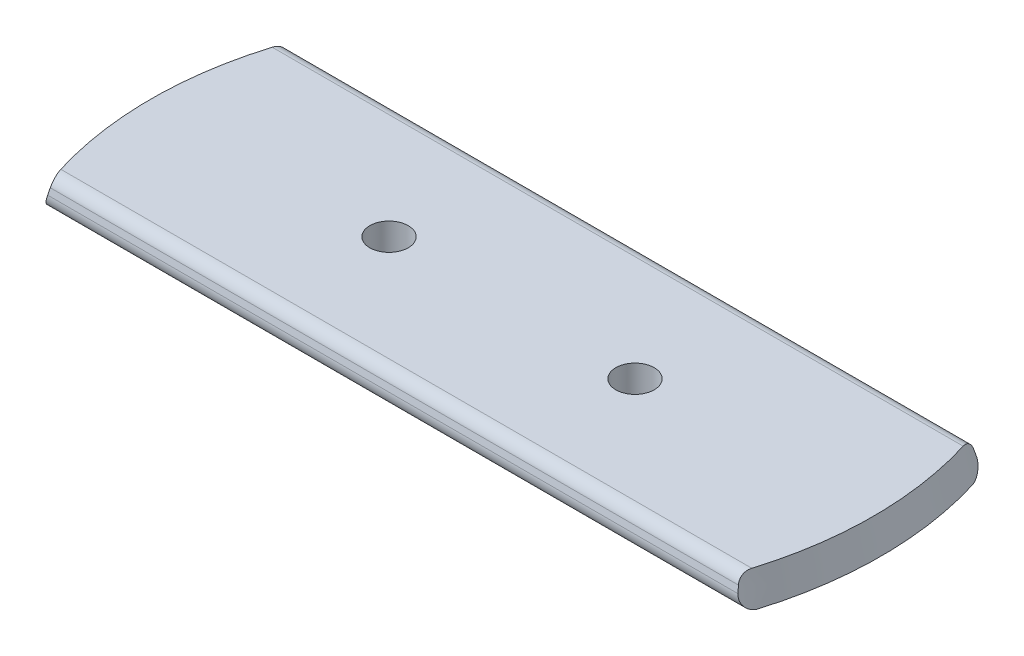
ISO-10303-21;
HEADER;
FILE_DESCRIPTION(('STEP AP214'),'2;1');
FILE_NAME('part.step','',(''),(''),'','','');
FILE_SCHEMA(('AUTOMOTIVE_DESIGN { 1 0 10303 214 1 1 1 1 }'));
ENDSEC;
DATA;
#1=APPLICATION_CONTEXT('core data for automotive mechanical design processes');
#2=APPLICATION_PROTOCOL_DEFINITION('international standard','automotive_design',2000,#1);
#3=PRODUCT_CONTEXT('',#1,'mechanical');
#4=PRODUCT('Part','Part','',(#3));
#5=PRODUCT_RELATED_PRODUCT_CATEGORY('part','',(#4));
#6=PRODUCT_DEFINITION_FORMATION('','',#4);
#7=PRODUCT_DEFINITION_CONTEXT('part definition',#1,'design');
#8=PRODUCT_DEFINITION('design','',#6,#7);
#9=PRODUCT_DEFINITION_SHAPE('','',#8);
#10=(LENGTH_UNIT() NAMED_UNIT(*) SI_UNIT(.MILLI.,.METRE.));
#11=(NAMED_UNIT(*) PLANE_ANGLE_UNIT() SI_UNIT($,.RADIAN.));
#12=(NAMED_UNIT(*) SI_UNIT($,.STERADIAN.) SOLID_ANGLE_UNIT());
#13=UNCERTAINTY_MEASURE_WITH_UNIT(LENGTH_MEASURE(1.E-05),#10,'distance_accuracy_value','');
#14=(GEOMETRIC_REPRESENTATION_CONTEXT(3) GLOBAL_UNCERTAINTY_ASSIGNED_CONTEXT((#13)) GLOBAL_UNIT_ASSIGNED_CONTEXT((#10,
#11,#12)) REPRESENTATION_CONTEXT('',''));
#15=CARTESIAN_POINT('',(0.,0.,0.));
#16=DIRECTION('',(0.,0.,1.));
#17=DIRECTION('',(1.,0.,0.));
#18=AXIS2_PLACEMENT_3D('',#15,#16,#17);
#19=CARTESIAN_POINT('',(0.,0.,0.));
#20=DIRECTION('',(0.,-1.,0.));
#21=DIRECTION('',(0.,0.,1.));
#22=AXIS2_PLACEMENT_3D('',#19,#20,#21);
#23=CONICAL_SURFACE('',#22,7.62,0.244346095279206);
#24=CARTESIAN_POINT('',(-7.07136729754981,0.635,-2.38167671819458));
#25=CARTESIAN_POINT('',(-7.09031812268111,0.529190850392023,-2.40805790214887));
#26=CARTESIAN_POINT('',(-7.10919666856523,0.423369608677368,-2.43444210100397));
#27=CARTESIAN_POINT('',(-7.14680920166574,0.211702942010479,-2.4872165282725));
#28=CARTESIAN_POINT('',(-7.16554318888345,0.105857517058467,-2.51360675668587));
#29=CARTESIAN_POINT('',(-7.18420489685532,0.,-2.54));
#30=B_SPLINE_CURVE_WITH_KNOTS('',3,(#24,#25,#26,#27,#28,#29),.UNSPECIFIED.,.F.,.F.,(4,2,4),(0.,
0.33204810762539,0.66409621218932),.UNSPECIFIED.);
#31=CARTESIAN_POINT('',(-7.10577247600336,0.44244816148174,-2.42968528353612));
#32=VERTEX_POINT('',#31);
#33=CARTESIAN_POINT('',(-7.12837396531329,0.315448161481469,-2.46134993989727));
#34=VERTEX_POINT('',#33);
#35=EDGE_CURVE('E102',#32,#34,#30,.T.);
#36=ORIENTED_EDGE('',*,*,#35,.T.);
#37=CARTESIAN_POINT('',(-7.12837396531835,0.315448161482316,-2.46134993989706));
#38=CARTESIAN_POINT('',(-7.13084393768899,0.301515160433442,-2.46483612463567));
#39=CARTESIAN_POINT('',(-7.1337918598921,0.287385541303617,-2.4670927922483));
#40=CARTESIAN_POINT('',(-7.1404914821392,0.25919177810484,-2.46922998415248));
#41=CARTESIAN_POINT('',(-7.14424002056994,0.245127592629542,-2.46911968984436));
#42=CARTESIAN_POINT('',(-7.152403715775,0.217430665918453,-2.46663344452182));
#43=CARTESIAN_POINT('',(-7.15681782558196,0.203797287044659,-2.46426102125269));
#44=CARTESIAN_POINT('',(-7.16617081488829,0.177250402664724,-2.45740982559918));
#45=CARTESIAN_POINT('',(-7.17111016999144,0.164337566010209,-2.45292913141014));
#46=CARTESIAN_POINT('',(-7.18169106797296,0.138724302566991,-2.44168856401171));
#47=CARTESIAN_POINT('',(-7.18735730178233,0.126089903395089,-2.43480159569103));
#48=CARTESIAN_POINT('',(-7.19894136926041,0.102236345878372,-2.41907129367297));
#49=CARTESIAN_POINT('',(-7.20485924437761,0.0910174218968979,-2.41022763666808));
#50=CARTESIAN_POINT('',(-7.21718697424704,0.0695298397669834,-2.39015817999625));
#51=CARTESIAN_POINT('',(-7.22360295844876,0.0593773660752167,-2.37881143554631));
#52=CARTESIAN_POINT('',(-7.23634002520104,0.0412272915812912,-2.35444655816891));
#53=CARTESIAN_POINT('',(-7.24266103599326,0.0332312496985651,-2.34142722608533));
#54=CARTESIAN_POINT('',(-7.25511941823189,0.019531569749466,-2.31380242139184));
#55=CARTESIAN_POINT('',(-7.26125131899737,0.0138725183345056,-2.29917230054427));
#56=CARTESIAN_POINT('',(-7.27298328432046,0.00532517605474581,-2.26895140657365));
#57=CARTESIAN_POINT('',(-7.27858466066921,0.00242988129697616,-2.2533631689033));
#58=CARTESIAN_POINT('',(-7.28629728384888,0.000338591472284553,-2.23003364885186));
#59=CARTESIAN_POINT('',(-7.28869471116603,-2.13890351914555E-06,-2.22247726528848));
#60=CARTESIAN_POINT('',(-7.29099725087828,0.,-2.21489482542296));
#61=B_SPLINE_CURVE_WITH_KNOTS('',3,(#37,#38,#39,#40,#41,#42,#43,#44,#45,#46,#47,#48,#49,#50,#51,
#52,#53,#54,#55,#56,#57,#58,#59,#60),.UNSPECIFIED.,.F.,.F.,(4,2,2,2,2,2,2,2,2,2,2,4),(0.,
0.0436250466490189,0.0870809032654025,0.130469101981918,0.173896928273261,0.220093463351432,
0.266297637281698,0.315637908405188,0.365013753373083,0.415292371505196,0.465443232968654,
0.489217638261168),.UNSPECIFIED.);
#62=CARTESIAN_POINT('',(-7.29099725087828,0.,-2.21489482542296));
#63=VERTEX_POINT('',#62);
#64=EDGE_CURVE('E109',#34,#63,#61,.T.);
#65=ORIENTED_EDGE('',*,*,#64,.T.);
#66=CARTESIAN_POINT('',(0.,0.,0.));
#67=DIRECTION('',(0.,1.,0.));
#68=DIRECTION('',(0.,0.,1.));
#69=AXIS2_PLACEMENT_3D('',#66,#67,#68);
#70=CIRCLE('',#69,7.62);
#71=CARTESIAN_POINT('',(-7.29099725087828,0.,2.21489482542296));
#72=VERTEX_POINT('',#71);
#73=EDGE_CURVE('E223',#63,#72,#70,.T.);
#74=ORIENTED_EDGE('',*,*,#73,.T.);
#75=CARTESIAN_POINT('',(-7.29099725087828,0.,2.21489482542296));
#76=CARTESIAN_POINT('',(-7.28638638414374,-7.59393130267067E-06,2.23008557273685));
#77=CARTESIAN_POINT('',(-7.28140331963555,0.00136128059969172,2.24513799558685));
#78=CARTESIAN_POINT('',(-7.27088782515327,0.00665497586977408,2.27454194812201));
#79=CARTESIAN_POINT('',(-7.26535697663801,0.0105726107175155,2.28889532674825));
#80=CARTESIAN_POINT('',(-7.2539207278495,0.0207620811084611,2.31654791265885));
#81=CARTESIAN_POINT('',(-7.24801584129948,0.0270307434945639,2.32984851169635));
#82=CARTESIAN_POINT('',(-7.23599614104069,0.0417092224968806,2.35511680914393));
#83=CARTESIAN_POINT('',(-7.22988117999197,0.0501205695933452,2.36708354598066));
#84=CARTESIAN_POINT('',(-7.21731618369735,0.069317504012406,2.38994323677266));
#85=CARTESIAN_POINT('',(-7.21086445419582,0.0801994808354202,2.40075448406255));
#86=CARTESIAN_POINT('',(-7.19812659643766,0.103788056939192,2.42028946304723));
#87=CARTESIAN_POINT('',(-7.19184050108704,0.116495015596494,2.42901278268171));
#88=CARTESIAN_POINT('',(-7.17959774063944,0.143519725418315,2.44413600306103));
#89=CARTESIAN_POINT('',(-7.17364391838839,0.157848904789851,2.45051788022366));
#90=CARTESIAN_POINT('',(-7.1623470755893,0.187638744165003,2.46057597355327));
#91=CARTESIAN_POINT('',(-7.15700335815676,0.203098079458742,2.46425530332043));
#92=CARTESIAN_POINT('',(-7.14716345540344,0.234657001115985,2.46865427321462));
#93=CARTESIAN_POINT('',(-7.14266489933405,0.250754638366388,2.46938231384743));
#94=CARTESIAN_POINT('',(-7.13468687267587,0.283134110644106,2.46774727571173));
#95=CARTESIAN_POINT('',(-7.13121320897672,0.299416472183395,2.46536698286231));
#96=CARTESIAN_POINT('',(-7.12837396531342,0.315448161480723,2.46134993989746));
#97=B_SPLINE_CURVE_WITH_KNOTS('',3,(#75,#76,#77,#78,#79,#80,#81,#82,#83,#84,#85,#86,#87,#88,#89,
#90,#91,#92,#93,#94,#95,#96),.UNSPECIFIED.,.F.,.F.,(4,2,2,2,2,2,2,2,2,2,4),(0.,
0.047526950621419,0.0949204826246814,0.142250276939844,0.189613973316676,0.239306056779011,
0.289007939088142,0.339084757195531,0.389103791005208,0.438980350979976,0.489134304300679),.UNSPECIFIED.);
#98=CARTESIAN_POINT('',(-7.12837396531329,0.315448161481469,2.46134993989727));
#99=VERTEX_POINT('',#98);
#100=EDGE_CURVE('E110',#72,#99,#97,.T.);
#101=ORIENTED_EDGE('',*,*,#100,.T.);
#102=CARTESIAN_POINT('',(-7.07136729754981,0.635,2.38167671819458));
#103=CARTESIAN_POINT('',(-7.09031812268111,0.529190850392023,2.40805790214887));
#104=CARTESIAN_POINT('',(-7.10919666856523,0.423369608677368,2.43444210100397));
#105=CARTESIAN_POINT('',(-7.14680920166574,0.211702942010479,2.4872165282725));
#106=CARTESIAN_POINT('',(-7.16554318888345,0.105857517058467,2.51360675668587));
#107=CARTESIAN_POINT('',(-7.18420489685532,0.,2.54));
#108=B_SPLINE_CURVE_WITH_KNOTS('',3,(#102,#103,#104,#105,#106,#107),.UNSPECIFIED.,.F.,.F.,(4,2,
4),(0.,0.33204810762539,0.66409621218932),.UNSPECIFIED.);
#109=CARTESIAN_POINT('',(-7.10577247600337,0.442448161481699,2.42968528353613));
#110=VERTEX_POINT('',#109);
#111=EDGE_CURVE('E126',#110,#99,#108,.T.);
#112=ORIENTED_EDGE('',*,*,#111,.F.);
#113=CARTESIAN_POINT('',(-7.10577247600706,0.442448161482315,2.42968528353598));
#114=CARTESIAN_POINT('',(-7.10349493653351,0.455190840180997,2.42652367293703));
#115=CARTESIAN_POINT('',(-7.10161969076567,0.467751363055435,2.4223279473886));
#116=CARTESIAN_POINT('',(-7.09871118353528,0.492143798968163,2.41200150451889));
#117=CARTESIAN_POINT('',(-7.09767738366437,0.503976173432068,2.40587202801924));
#118=CARTESIAN_POINT('',(-7.09648539983695,0.526579570363645,2.39179802009882));
#119=CARTESIAN_POINT('',(-7.09632832799722,0.537349227796826,2.38385119668773));
#120=CARTESIAN_POINT('',(-7.09687931673423,0.557488946528283,2.36638348901917));
#121=CARTESIAN_POINT('',(-7.09758694831479,0.566859699262975,2.35686338732135));
#122=CARTESIAN_POINT('',(-7.09980988854957,0.583888451659112,2.33661206469922));
#123=CARTESIAN_POINT('',(-7.10131881827999,0.591559309522754,2.32589092949271));
#124=CARTESIAN_POINT('',(-7.10506652901307,0.605113801277541,2.30348248718449));
#125=CARTESIAN_POINT('',(-7.10730582607874,0.610996165759758,2.29179450129654));
#126=CARTESIAN_POINT('',(-7.11251075034615,0.621038219445362,2.26736219457251));
#127=CARTESIAN_POINT('',(-7.11549889267274,0.625131019863454,2.25459528895959));
#128=CARTESIAN_POINT('',(-7.12204441006096,0.631242713165914,2.22873511747242));
#129=CARTESIAN_POINT('',(-7.12560103142227,0.633264326133083,2.21564230283383));
#130=CARTESIAN_POINT('',(-7.13124867921781,0.634756615424818,2.19610190990402));
#131=CARTESIAN_POINT('',(-7.13316672504503,0.635001384894442,2.18965630332628));
#132=CARTESIAN_POINT('',(-7.13513317855701,0.635,2.18323016906187));
#133=B_SPLINE_CURVE_WITH_KNOTS('',3,(#113,#114,#115,#116,#117,#118,#119,#120,#121,#122,#123,
#124,#125,#126,#127,#128,#129,#130,#131,#132),.UNSPECIFIED.,.F.,.F.,(4,2,2,2,2,2,2,2,2,4),(0.,
0.0399343126826257,0.0798430528270583,0.119802405144785,0.159741940896617,0.199368192615765,
0.239022504332153,0.280053361366527,0.321030263385357,0.34119725557929),.UNSPECIFIED.);
#134=CARTESIAN_POINT('',(-7.13513317855701,0.635,2.18323016906187));
#135=VERTEX_POINT('',#134);
#136=EDGE_CURVE('E128',#110,#135,#133,.T.);
#137=ORIENTED_EDGE('',*,*,#136,.T.);
#138=CARTESIAN_POINT('',(0.,0.635,0.));
#139=DIRECTION('',(0.,1.,0.));
#140=DIRECTION('',(0.,0.,1.));
#141=AXIS2_PLACEMENT_3D('',#138,#139,#140);
#142=CIRCLE('',#141,7.46167671819458);
#143=CARTESIAN_POINT('',(-7.13513317855701,0.635,-2.18323016906187));
#144=VERTEX_POINT('',#143);
#145=EDGE_CURVE('E104',#144,#135,#142,.T.);
#146=ORIENTED_EDGE('',*,*,#145,.F.);
#147=CARTESIAN_POINT('',(-7.13513317855701,0.635,-2.18323016906187));
#148=CARTESIAN_POINT('',(-7.1308937481268,0.63501132519858,-2.19708139771942));
#149=CARTESIAN_POINT('',(-7.12688285008474,0.633867054135835,-2.21101492724024));
#150=CARTESIAN_POINT('',(-7.11943898492669,0.629265513485665,-2.23869289228956));
#151=CARTESIAN_POINT('',(-7.11600763701109,0.625801893505523,-2.25243670263306));
#152=CARTESIAN_POINT('',(-7.1098621282821,0.616550230062148,-2.2793289268661));
#153=CARTESIAN_POINT('',(-7.10714947045426,0.610757378181036,-2.29247604608931));
#154=CARTESIAN_POINT('',(-7.10258232016253,0.596965182887461,-2.31769600661662));
#155=CARTESIAN_POINT('',(-7.10072636342012,0.588969641966529,-2.32977065224912));
#156=CARTESIAN_POINT('',(-7.09803842809603,0.571408301835303,-2.35190309845985));
#157=CARTESIAN_POINT('',(-7.09716154766516,0.561936371451527,-2.36202991500786));
#158=CARTESIAN_POINT('',(-7.09633442393187,0.541438451920595,-2.38063147335321));
#159=CARTESIAN_POINT('',(-7.09638487026594,0.53041131223973,-2.38910498088091));
#160=CARTESIAN_POINT('',(-7.09744111708153,0.507020106931098,-2.40420608645806));
#161=CARTESIAN_POINT('',(-7.09845795319739,0.494642061757388,-2.41081121669747));
#162=CARTESIAN_POINT('',(-7.10142462135001,0.469059826979225,-2.42188977995475));
#163=CARTESIAN_POINT('',(-7.10337510177499,0.455855068794968,-2.42636172722486));
#164=CARTESIAN_POINT('',(-7.10577247600328,0.442448161482179,-2.42968528353601));
#165=B_SPLINE_CURVE_WITH_KNOTS('',3,(#147,#148,#149,#150,#151,#152,#153,#154,#155,#156,#157,
#158,#159,#160,#161,#162,#163,#164),.UNSPECIFIED.,.F.,.F.,(4,2,2,2,2,2,2,2,4),(0.,
0.0434273659711492,0.0869741251996414,0.130611246822674,0.174173504900628,0.215643382767214,
0.257144102294513,0.299124504105211,0.341134102447936),.UNSPECIFIED.);
#166=EDGE_CURVE('E100',#144,#32,#165,.T.);
#167=ORIENTED_EDGE('',*,*,#166,.T.);
#168=EDGE_LOOP('',(#36,#65,#74,#101,#112,#137,#146,#167));
#169=FACE_BOUND('',#168,.T.);
#170=ADVANCED_FACE('F33',(#169),#23,.T.);
#171=CARTESIAN_POINT('',(-7.18420489685532,0.,2.54));
#172=DIRECTION('',(0.,0.241921895599668,0.970295726275996));
#173=DIRECTION('',(0.,-0.970295726275997,0.241921895599668));
#174=AXIS2_PLACEMENT_3D('',#171,#172,#173);
#175=PLANE('',#174);
#176=ORIENTED_EDGE('',*,*,#111,.T.);
#177=DIRECTION('',(1.,0.,0.));
#178=VECTOR('',#177,1.);
#179=CARTESIAN_POINT('',(-7.18420489685532,0.315448161482316,2.46134993989706));
#180=LINE('',#179,#178);
#181=CARTESIAN_POINT('',(7.12837396531329,0.315448161481469,2.46134993989727));
#182=VERTEX_POINT('',#181);
#183=EDGE_CURVE('E11',#99,#182,#180,.T.);
#184=ORIENTED_EDGE('',*,*,#183,.T.);
#185=CARTESIAN_POINT('',(7.07136729754981,0.635,2.38167671819458));
#186=CARTESIAN_POINT('',(7.09031812268111,0.529190850392023,2.40805790214887));
#187=CARTESIAN_POINT('',(7.10919666856523,0.423369608677368,2.43444210100397));
#188=CARTESIAN_POINT('',(7.14680920166574,0.211702942010479,2.4872165282725));
#189=CARTESIAN_POINT('',(7.16554318888345,0.105857517058467,2.51360675668588));
#190=CARTESIAN_POINT('',(7.18420489685532,0.,2.54));
#191=B_SPLINE_CURVE_WITH_KNOTS('',3,(#185,#186,#187,#188,#189,#190),.UNSPECIFIED.,.F.,.F.,(4,2,
4),(0.,0.33204810762539,0.66409621218932),.UNSPECIFIED.);
#192=CARTESIAN_POINT('',(7.10577247600336,0.442448161481741,2.42968528353612));
#193=VERTEX_POINT('',#192);
#194=EDGE_CURVE('E131',#193,#182,#191,.T.);
#195=ORIENTED_EDGE('',*,*,#194,.F.);
#196=DIRECTION('',(1.,0.,0.));
#197=VECTOR('',#196,1.);
#198=CARTESIAN_POINT('',(-7.07136729754981,0.442448161482315,2.42968528353598));
#199=LINE('',#198,#197);
#200=EDGE_CURVE('E42',#193,#110,#199,.F.);
#201=ORIENTED_EDGE('',*,*,#200,.T.);
#202=EDGE_LOOP('',(#176,#184,#195,#201));
#203=FACE_BOUND('',#202,.T.);
#204=ADVANCED_FACE('F148',(#203),#175,.T.);
#205=CARTESIAN_POINT('',(0.,0.,0.));
#206=DIRECTION('',(0.,-1.,0.));
#207=DIRECTION('',(0.,0.,1.));
#208=AXIS2_PLACEMENT_3D('',#205,#206,#207);
#209=CONICAL_SURFACE('',#208,7.62,0.244346095279206);
#210=CARTESIAN_POINT('',(0.,0.,0.));
#211=DIRECTION('',(0.,1.,0.));
#212=DIRECTION('',(0.,0.,1.));
#213=AXIS2_PLACEMENT_3D('',#210,#211,#212);
#214=CIRCLE('',#213,7.62);
#215=CARTESIAN_POINT('',(7.29099725087828,0.,2.21489482542296));
#216=VERTEX_POINT('',#215);
#217=CARTESIAN_POINT('',(7.29099725087828,0.,-2.21489482542296));
#218=VERTEX_POINT('',#217);
#219=EDGE_CURVE('E229',#216,#218,#214,.T.);
#220=ORIENTED_EDGE('',*,*,#219,.T.);
#221=CARTESIAN_POINT('',(7.29099725087828,0.,-2.21489482542296));
#222=CARTESIAN_POINT('',(7.28638638414374,-7.59393130273133E-06,-2.23008557273685));
#223=CARTESIAN_POINT('',(7.28140331963555,0.00136128059969167,-2.24513799558685));
#224=CARTESIAN_POINT('',(7.27088782515327,0.00665497586977407,-2.27454194812201));
#225=CARTESIAN_POINT('',(7.26535697663801,0.0105726107175155,-2.28889532674825));
#226=CARTESIAN_POINT('',(7.2539207278495,0.0207620811084612,-2.31654791265886));
#227=CARTESIAN_POINT('',(7.24801584129948,0.027030743494564,-2.32984851169636));
#228=CARTESIAN_POINT('',(7.23599614104069,0.0417092224968808,-2.35511680914393));
#229=CARTESIAN_POINT('',(7.22988117999197,0.0501205695933454,-2.36708354598066));
#230=CARTESIAN_POINT('',(7.21731618369735,0.069317504012406,-2.38994323677266));
#231=CARTESIAN_POINT('',(7.21086445419582,0.0801994808354201,-2.40075448406255));
#232=CARTESIAN_POINT('',(7.19812659643766,0.103788056939192,-2.42028946304724));
#233=CARTESIAN_POINT('',(7.19184050108704,0.116495015596494,-2.42901278268172));
#234=CARTESIAN_POINT('',(7.17959774063944,0.143519725418315,-2.44413600306104));
#235=CARTESIAN_POINT('',(7.17364391838839,0.157848904789851,-2.45051788022366));
#236=CARTESIAN_POINT('',(7.1623470755893,0.187638744165003,-2.46057597355327));
#237=CARTESIAN_POINT('',(7.15700335815676,0.203098079458742,-2.46425530332043));
#238=CARTESIAN_POINT('',(7.14716345540344,0.234657001115985,-2.46865427321462));
#239=CARTESIAN_POINT('',(7.14266489933405,0.250754638366388,-2.46938231384743));
#240=CARTESIAN_POINT('',(7.13468687267587,0.283134110644107,-2.46774727571173));
#241=CARTESIAN_POINT('',(7.13121320897672,0.299416472183396,-2.46536698286231));
#242=CARTESIAN_POINT('',(7.12837396531342,0.315448161480724,-2.46134993989746));
#243=B_SPLINE_CURVE_WITH_KNOTS('',3,(#221,#222,#223,#224,#225,#226,#227,#228,#229,#230,#231,
#232,#233,#234,#235,#236,#237,#238,#239,#240,#241,#242),.UNSPECIFIED.,.F.,.F.,(4,2,2,2,2,2,2,2,
2,2,4),(0.,0.0475269506214188,0.0949204826246814,0.142250276939845,0.189613973316676,
0.239306056779012,0.289007939088142,0.339084757195531,0.389103791005208,0.438980350979977,
0.48913430430068),.UNSPECIFIED.);
#244=CARTESIAN_POINT('',(7.12837396531329,0.315448161481469,-2.46134993989727));
#245=VERTEX_POINT('',#244);
#246=EDGE_CURVE('E189',#218,#245,#243,.T.);
#247=ORIENTED_EDGE('',*,*,#246,.T.);
#248=CARTESIAN_POINT('',(7.07136729754981,0.635,-2.38167671819458));
#249=CARTESIAN_POINT('',(7.09031812268111,0.529190850392023,-2.40805790214887));
#250=CARTESIAN_POINT('',(7.10919666856523,0.423369608677368,-2.43444210100397));
#251=CARTESIAN_POINT('',(7.14680920166574,0.211702942010479,-2.4872165282725));
#252=CARTESIAN_POINT('',(7.16554318888345,0.105857517058467,-2.51360675668588));
#253=CARTESIAN_POINT('',(7.18420489685532,0.,-2.54));
#254=B_SPLINE_CURVE_WITH_KNOTS('',3,(#248,#249,#250,#251,#252,#253),.UNSPECIFIED.,.F.,.F.,(4,2,
4),(0.,0.33204810762539,0.66409621218932),.UNSPECIFIED.);
#255=CARTESIAN_POINT('',(7.10577247600337,0.442448161481699,-2.42968528353613));
#256=VERTEX_POINT('',#255);
#257=EDGE_CURVE('E120',#256,#245,#254,.T.);
#258=ORIENTED_EDGE('',*,*,#257,.F.);
#259=CARTESIAN_POINT('',(7.10577247600706,0.442448161482315,-2.42968528353598));
#260=CARTESIAN_POINT('',(7.10349493653351,0.455190840180998,-2.42652367293703));
#261=CARTESIAN_POINT('',(7.10161969076567,0.467751363055436,-2.42232794738861));
#262=CARTESIAN_POINT('',(7.09871118353528,0.492143798968164,-2.41200150451889));
#263=CARTESIAN_POINT('',(7.09767738366437,0.503976173432068,-2.40587202801924));
#264=CARTESIAN_POINT('',(7.09648539983695,0.526579570363645,-2.39179802009882));
#265=CARTESIAN_POINT('',(7.09632832799722,0.537349227796827,-2.38385119668773));
#266=CARTESIAN_POINT('',(7.09687931673423,0.557488946528283,-2.36638348901917));
#267=CARTESIAN_POINT('',(7.09758694831479,0.566859699262975,-2.35686338732136));
#268=CARTESIAN_POINT('',(7.09980988854957,0.583888451659112,-2.33661206469922));
#269=CARTESIAN_POINT('',(7.10131881827999,0.591559309522754,-2.32589092949271));
#270=CARTESIAN_POINT('',(7.10506652901308,0.605113801277541,-2.3034824871845));
#271=CARTESIAN_POINT('',(7.10730582607874,0.610996165759758,-2.29179450129655));
#272=CARTESIAN_POINT('',(7.11251075034615,0.621038219445362,-2.26736219457252));
#273=CARTESIAN_POINT('',(7.11549889267274,0.625131019863454,-2.2545952889596));
#274=CARTESIAN_POINT('',(7.12204441006096,0.631242713165914,-2.22873511747242));
#275=CARTESIAN_POINT('',(7.12560103142227,0.633264326133084,-2.21564230283383));
#276=CARTESIAN_POINT('',(7.13124867921781,0.634756615424818,-2.19610190990402));
#277=CARTESIAN_POINT('',(7.13316672504503,0.635001384894442,-2.18965630332628));
#278=CARTESIAN_POINT('',(7.13513317855701,0.635,-2.18323016906188));
#279=B_SPLINE_CURVE_WITH_KNOTS('',3,(#259,#260,#261,#262,#263,#264,#265,#266,#267,#268,#269,
#270,#271,#272,#273,#274,#275,#276,#277,#278),.UNSPECIFIED.,.F.,.F.,(4,2,2,2,2,2,2,2,2,4),(0.,
0.0399343126826256,0.0798430528270584,0.119802405144785,0.159741940896617,0.199368192615765,
0.239022504332153,0.280053361366528,0.321030263385357,0.34119725557929),.UNSPECIFIED.);
#280=CARTESIAN_POINT('',(7.13513317855701,0.635,-2.18323016906188));
#281=VERTEX_POINT('',#280);
#282=EDGE_CURVE('E125',#256,#281,#279,.T.);
#283=ORIENTED_EDGE('',*,*,#282,.T.);
#284=CARTESIAN_POINT('',(0.,0.635,0.));
#285=DIRECTION('',(0.,1.,0.));
#286=DIRECTION('',(0.,0.,1.));
#287=AXIS2_PLACEMENT_3D('',#284,#285,#286);
#288=CIRCLE('',#287,7.46167671819458);
#289=CARTESIAN_POINT('',(7.13513317855701,0.635,2.18323016906188));
#290=VERTEX_POINT('',#289);
#291=EDGE_CURVE('E121',#290,#281,#288,.T.);
#292=ORIENTED_EDGE('',*,*,#291,.F.);
#293=CARTESIAN_POINT('',(7.13513317855701,0.635,2.18323016906188));
#294=CARTESIAN_POINT('',(7.1308937481268,0.63501132519858,2.19708139771942));
#295=CARTESIAN_POINT('',(7.12688285008474,0.633867054135835,2.21101492724024));
#296=CARTESIAN_POINT('',(7.11943898492669,0.629265513485665,2.23869289228956));
#297=CARTESIAN_POINT('',(7.11600763701109,0.625801893505523,2.25243670263306));
#298=CARTESIAN_POINT('',(7.1098621282821,0.616550230062148,2.2793289268661));
#299=CARTESIAN_POINT('',(7.10714947045426,0.610757378181036,2.29247604608931));
#300=CARTESIAN_POINT('',(7.10258232016253,0.596965182887461,2.31769600661662));
#301=CARTESIAN_POINT('',(7.10072636342012,0.588969641966529,2.32977065224912));
#302=CARTESIAN_POINT('',(7.09803842809603,0.571408301835303,2.35190309845986));
#303=CARTESIAN_POINT('',(7.09716154766516,0.561936371451527,2.36202991500786));
#304=CARTESIAN_POINT('',(7.09633442393187,0.541438451920595,2.38063147335321));
#305=CARTESIAN_POINT('',(7.09638487026594,0.53041131223973,2.38910498088091));
#306=CARTESIAN_POINT('',(7.09744111708153,0.507020106931098,2.40420608645807));
#307=CARTESIAN_POINT('',(7.09845795319739,0.494642061757388,2.41081121669747));
#308=CARTESIAN_POINT('',(7.10142462135001,0.469059826979225,2.42188977995475));
#309=CARTESIAN_POINT('',(7.10337510177499,0.455855068794968,2.42636172722487));
#310=CARTESIAN_POINT('',(7.10577247600328,0.442448161482179,2.42968528353601));
#311=B_SPLINE_CURVE_WITH_KNOTS('',3,(#293,#294,#295,#296,#297,#298,#299,#300,#301,#302,#303,
#304,#305,#306,#307,#308,#309,#310),.UNSPECIFIED.,.F.,.F.,(4,2,2,2,2,2,2,2,4),(0.,
0.0434273659711492,0.0869741251996414,0.130611246822674,0.174173504900627,0.215643382767214,
0.257144102294513,0.299124504105211,0.341134102447936),.UNSPECIFIED.);
#312=EDGE_CURVE('E56',#290,#193,#311,.T.);
#313=ORIENTED_EDGE('',*,*,#312,.T.);
#314=ORIENTED_EDGE('',*,*,#194,.T.);
#315=CARTESIAN_POINT('',(7.12837396531835,0.315448161482316,2.46134993989706));
#316=CARTESIAN_POINT('',(7.13084393768899,0.301515160433442,2.46483612463567));
#317=CARTESIAN_POINT('',(7.1337918598921,0.287385541303617,2.46709279224831));
#318=CARTESIAN_POINT('',(7.1404914821392,0.25919177810484,2.46922998415249));
#319=CARTESIAN_POINT('',(7.14424002056994,0.245127592629543,2.46911968984436));
#320=CARTESIAN_POINT('',(7.152403715775,0.217430665918453,2.46663344452182));
#321=CARTESIAN_POINT('',(7.15681782558196,0.203797287044659,2.46426102125269));
#322=CARTESIAN_POINT('',(7.16617081488829,0.177250402664724,2.45740982559918));
#323=CARTESIAN_POINT('',(7.17111016999144,0.164337566010209,2.45292913141014));
#324=CARTESIAN_POINT('',(7.18169106797296,0.138724302566991,2.44168856401171));
#325=CARTESIAN_POINT('',(7.18735730178233,0.126089903395088,2.43480159569103));
#326=CARTESIAN_POINT('',(7.19894136926041,0.102236345878372,2.41907129367297));
#327=CARTESIAN_POINT('',(7.20485924437761,0.091017421896898,2.41022763666809));
#328=CARTESIAN_POINT('',(7.21718697424704,0.0695298397669834,2.39015817999625));
#329=CARTESIAN_POINT('',(7.22360295844876,0.0593773660752164,2.37881143554631));
#330=CARTESIAN_POINT('',(7.23634002520104,0.0412272915812907,2.35444655816891));
#331=CARTESIAN_POINT('',(7.24266103599326,0.0332312496985648,2.34142722608533));
#332=CARTESIAN_POINT('',(7.2551194182319,0.0195315697494658,2.31380242139184));
#333=CARTESIAN_POINT('',(7.26125131899737,0.0138725183345054,2.29917230054427));
#334=CARTESIAN_POINT('',(7.27298328432046,0.00532517605474563,2.26895140657365));
#335=CARTESIAN_POINT('',(7.27858466066921,0.00242988129697605,2.2533631689033));
#336=CARTESIAN_POINT('',(7.28629728384888,0.000338591472284529,2.23003364885187));
#337=CARTESIAN_POINT('',(7.28869471116603,-2.13890351914323E-06,2.22247726528848));
#338=CARTESIAN_POINT('',(7.29099725087828,0.,2.21489482542296));
#339=B_SPLINE_CURVE_WITH_KNOTS('',3,(#315,#316,#317,#318,#319,#320,#321,#322,#323,#324,#325,
#326,#327,#328,#329,#330,#331,#332,#333,#334,#335,#336,#337,#338),.UNSPECIFIED.,.F.,.F.,(4,2,2,
2,2,2,2,2,2,2,2,4),(0.,0.0436250466490192,0.0870809032654031,0.130469101981918,
0.173896928273262,0.220093463351433,0.266297637281699,0.31563790840519,0.365013753373085,
0.415292371505198,0.465443232968655,0.489217638261169),.UNSPECIFIED.);
#340=EDGE_CURVE('E49',#182,#216,#339,.T.);
#341=ORIENTED_EDGE('',*,*,#340,.T.);
#342=EDGE_LOOP('',(#220,#247,#258,#283,#292,#313,#314,#341));
#343=FACE_BOUND('',#342,.T.);
#344=ADVANCED_FACE('F198',(#343),#209,.T.);
#345=CARTESIAN_POINT('',(-7.18420489685532,0.,-2.54));
#346=DIRECTION('',(0.,0.241921895599668,-0.970295726275996));
#347=DIRECTION('',(0.,0.970295726275997,0.241921895599668));
#348=AXIS2_PLACEMENT_3D('',#345,#346,#347);
#349=PLANE('',#348);
#350=ORIENTED_EDGE('',*,*,#257,.T.);
#351=DIRECTION('',(-1.,0.,0.));
#352=VECTOR('',#351,1.);
#353=CARTESIAN_POINT('',(-7.18420489685532,0.315448161482316,-2.46134993989706));
#354=LINE('',#353,#352);
#355=EDGE_CURVE('E119',#245,#34,#354,.T.);
#356=ORIENTED_EDGE('',*,*,#355,.T.);
#357=ORIENTED_EDGE('',*,*,#35,.F.);
#358=DIRECTION('',(-1.,0.,0.));
#359=VECTOR('',#358,1.);
#360=CARTESIAN_POINT('',(7.07136729754981,0.442448161482315,-2.42968528353598));
#361=LINE('',#360,#359);
#362=EDGE_CURVE('E116',#32,#256,#361,.F.);
#363=ORIENTED_EDGE('',*,*,#362,.T.);
#364=EDGE_LOOP('',(#350,#356,#357,#363));
#365=FACE_BOUND('',#364,.T.);
#366=ADVANCED_FACE('F115',(#365),#349,.T.);
#367=CARTESIAN_POINT('',(0.,0.635,0.));
#368=DIRECTION('',(0.,1.,0.));
#369=DIRECTION('',(0.,0.,1.));
#370=AXIS2_PLACEMENT_3D('',#367,#368,#369);
#371=PLANE('',#370);
#372=CARTESIAN_POINT('',(-2.54,0.635,0.));
#373=DIRECTION('',(0.,1.,0.));
#374=DIRECTION('',(0.,0.,1.));
#375=AXIS2_PLACEMENT_3D('',#372,#373,#374);
#376=CIRCLE('',#375,0.396874999999997);
#377=CARTESIAN_POINT('',(-2.54,0.635,0.396874999999998));
#378=VERTEX_POINT('',#377);
#379=EDGE_CURVE('E258',#378,#378,#376,.T.);
#380=ORIENTED_EDGE('',*,*,#379,.F.);
#381=EDGE_LOOP('',(#380));
#382=FACE_BOUND('',#381,.T.);
#383=CARTESIAN_POINT('',(2.54,0.635,0.));
#384=DIRECTION('',(0.,1.,0.));
#385=DIRECTION('',(0.,0.,1.));
#386=AXIS2_PLACEMENT_3D('',#383,#384,#385);
#387=CIRCLE('',#386,0.396874999999997);
#388=CARTESIAN_POINT('',(2.54,0.635,0.396874999999997));
#389=VERTEX_POINT('',#388);
#390=EDGE_CURVE('E230',#389,#389,#387,.T.);
#391=ORIENTED_EDGE('',*,*,#390,.F.);
#392=EDGE_LOOP('',(#391));
#393=FACE_BOUND('',#392,.T.);
#394=ORIENTED_EDGE('',*,*,#291,.T.);
#395=DIRECTION('',(1.,0.,0.));
#396=VECTOR('',#395,1.);
#397=CARTESIAN_POINT('',(-7.07136729754981,0.635,-2.18323016906187));
#398=LINE('',#397,#396);
#399=EDGE_CURVE('E235',#281,#144,#398,.F.);
#400=ORIENTED_EDGE('',*,*,#399,.T.);
#401=ORIENTED_EDGE('',*,*,#145,.T.);
#402=DIRECTION('',(-1.,0.,0.));
#403=VECTOR('',#402,1.);
#404=CARTESIAN_POINT('',(7.07136729754981,0.635,2.18323016906188));
#405=LINE('',#404,#403);
#406=EDGE_CURVE('E233',#135,#290,#405,.F.);
#407=ORIENTED_EDGE('',*,*,#406,.T.);
#408=EDGE_LOOP('',(#394,#400,#401,#407));
#409=FACE_BOUND('',#408,.T.);
#410=ADVANCED_FACE('F251',(#382,#393,#409),#371,.T.);
#411=CARTESIAN_POINT('',(0.,0.,0.));
#412=DIRECTION('',(0.,1.,0.));
#413=DIRECTION('',(0.,0.,1.));
#414=AXIS2_PLACEMENT_3D('',#411,#412,#413);
#415=PLANE('',#414);
#416=CARTESIAN_POINT('',(-2.54,0.,0.));
#417=DIRECTION('',(0.,-1.,0.));
#418=DIRECTION('',(0.,0.,-1.));
#419=AXIS2_PLACEMENT_3D('',#416,#417,#418);
#420=CIRCLE('',#419,0.396874999999998);
#421=CARTESIAN_POINT('',(-2.54,0.,-0.396874999999998));
#422=VERTEX_POINT('',#421);
#423=EDGE_CURVE('E261',#422,#422,#420,.T.);
#424=ORIENTED_EDGE('',*,*,#423,.F.);
#425=EDGE_LOOP('',(#424));
#426=FACE_BOUND('',#425,.T.);
#427=CARTESIAN_POINT('',(2.54,0.,0.));
#428=DIRECTION('',(0.,-1.,0.));
#429=DIRECTION('',(0.,0.,-1.));
#430=AXIS2_PLACEMENT_3D('',#427,#428,#429);
#431=CIRCLE('',#430,0.396874999999998);
#432=CARTESIAN_POINT('',(2.54,0.,-0.396874999999998));
#433=VERTEX_POINT('',#432);
#434=EDGE_CURVE('E255',#433,#433,#431,.T.);
#435=ORIENTED_EDGE('',*,*,#434,.F.);
#436=EDGE_LOOP('',(#435));
#437=FACE_BOUND('',#436,.T.);
#438=ORIENTED_EDGE('',*,*,#73,.F.);
#439=DIRECTION('',(1.,0.,0.));
#440=VECTOR('',#439,1.);
#441=CARTESIAN_POINT('',(0.,0.,-2.21489482542296));
#442=LINE('',#441,#440);
#443=EDGE_CURVE('E217',#63,#218,#442,.T.);
#444=ORIENTED_EDGE('',*,*,#443,.T.);
#445=ORIENTED_EDGE('',*,*,#219,.F.);
#446=DIRECTION('',(-1.,0.,0.));
#447=VECTOR('',#446,1.);
#448=CARTESIAN_POINT('',(0.,0.,2.21489482542296));
#449=LINE('',#448,#447);
#450=EDGE_CURVE('E218',#216,#72,#449,.T.);
#451=ORIENTED_EDGE('',*,*,#450,.T.);
#452=EDGE_LOOP('',(#438,#444,#445,#451));
#453=FACE_BOUND('',#452,.T.);
#454=ADVANCED_FACE('F227',(#426,#437,#453),#415,.F.);
#455=CARTESIAN_POINT('',(2.54,0.,0.));
#456=DIRECTION('',(0.,-1.,0.));
#457=DIRECTION('',(0.,0.,-1.));
#458=AXIS2_PLACEMENT_3D('',#455,#456,#457);
#459=CYLINDRICAL_SURFACE('',#458,0.396874999999997);
#460=ORIENTED_EDGE('',*,*,#390,.T.);
#461=EDGE_LOOP('',(#460));
#462=FACE_BOUND('',#461,.T.);
#463=ORIENTED_EDGE('',*,*,#434,.T.);
#464=EDGE_LOOP('',(#463));
#465=FACE_BOUND('',#464,.T.);
#466=ADVANCED_FACE('F269',(#462,#465),#459,.F.);
#467=CARTESIAN_POINT('',(-2.54,0.,0.));
#468=DIRECTION('',(0.,-1.,0.));
#469=DIRECTION('',(0.,0.,-1.));
#470=AXIS2_PLACEMENT_3D('',#467,#468,#469);
#471=CYLINDRICAL_SURFACE('',#470,0.396874999999997);
#472=ORIENTED_EDGE('',*,*,#379,.T.);
#473=EDGE_LOOP('',(#472));
#474=FACE_BOUND('',#473,.T.);
#475=ORIENTED_EDGE('',*,*,#423,.T.);
#476=EDGE_LOOP('',(#475));
#477=FACE_BOUND('',#476,.T.);
#478=ADVANCED_FACE('F265',(#474,#477),#471,.F.);
#479=CARTESIAN_POINT('',(-7.18420489685532,0.254,-2.21489482542296));
#480=DIRECTION('',(1.,0.,0.));
#481=DIRECTION('',(0.,0.,-1.));
#482=AXIS2_PLACEMENT_3D('',#479,#480,#481);
#483=CYLINDRICAL_SURFACE('',#482,0.254);
#484=ORIENTED_EDGE('',*,*,#246,.F.);
#485=ORIENTED_EDGE('',*,*,#443,.F.);
#486=ORIENTED_EDGE('',*,*,#64,.F.);
#487=ORIENTED_EDGE('',*,*,#355,.F.);
#488=EDGE_LOOP('',(#484,#485,#486,#487));
#489=FACE_BOUND('',#488,.T.);
#490=ADVANCED_FACE('F179',(#489),#483,.T.);
#491=CARTESIAN_POINT('',(0.,0.381,-2.18323016906188));
#492=DIRECTION('',(-1.,0.,0.));
#493=DIRECTION('',(0.,0.,1.));
#494=AXIS2_PLACEMENT_3D('',#491,#492,#493);
#495=CYLINDRICAL_SURFACE('',#494,0.254);
#496=ORIENTED_EDGE('',*,*,#282,.F.);
#497=ORIENTED_EDGE('',*,*,#362,.F.);
#498=ORIENTED_EDGE('',*,*,#166,.F.);
#499=ORIENTED_EDGE('',*,*,#399,.F.);
#500=EDGE_LOOP('',(#496,#497,#498,#499));
#501=FACE_BOUND('',#500,.T.);
#502=ADVANCED_FACE('F124',(#501),#495,.T.);
#503=CARTESIAN_POINT('',(-7.18420489685532,0.254,2.21489482542296));
#504=DIRECTION('',(-1.,0.,0.));
#505=DIRECTION('',(0.,0.,1.));
#506=AXIS2_PLACEMENT_3D('',#503,#504,#505);
#507=CYLINDRICAL_SURFACE('',#506,0.254);
#508=ORIENTED_EDGE('',*,*,#100,.F.);
#509=ORIENTED_EDGE('',*,*,#450,.F.);
#510=ORIENTED_EDGE('',*,*,#340,.F.);
#511=ORIENTED_EDGE('',*,*,#183,.F.);
#512=EDGE_LOOP('',(#508,#509,#510,#511));
#513=FACE_BOUND('',#512,.T.);
#514=ADVANCED_FACE('F178',(#513),#507,.T.);
#515=CARTESIAN_POINT('',(0.,0.381,2.18323016906188));
#516=DIRECTION('',(1.,0.,0.));
#517=DIRECTION('',(0.,0.,-1.));
#518=AXIS2_PLACEMENT_3D('',#515,#516,#517);
#519=CYLINDRICAL_SURFACE('',#518,0.254);
#520=ORIENTED_EDGE('',*,*,#136,.F.);
#521=ORIENTED_EDGE('',*,*,#200,.F.);
#522=ORIENTED_EDGE('',*,*,#312,.F.);
#523=ORIENTED_EDGE('',*,*,#406,.F.);
#524=EDGE_LOOP('',(#520,#521,#522,#523));
#525=FACE_BOUND('',#524,.T.);
#526=ADVANCED_FACE('F35',(#525),#519,.T.);
#527=CLOSED_SHELL('',(#170,#204,#344,#366,#410,#454,#466,#478,#490,#502,#514,#526));
#528=MANIFOLD_SOLID_BREP('B2',#527);
#529=ADVANCED_BREP_SHAPE_REPRESENTATION('',(#18,#528),#14);
#530=SHAPE_DEFINITION_REPRESENTATION(#9,#529);
ENDSEC;
END-ISO-10303-21;
